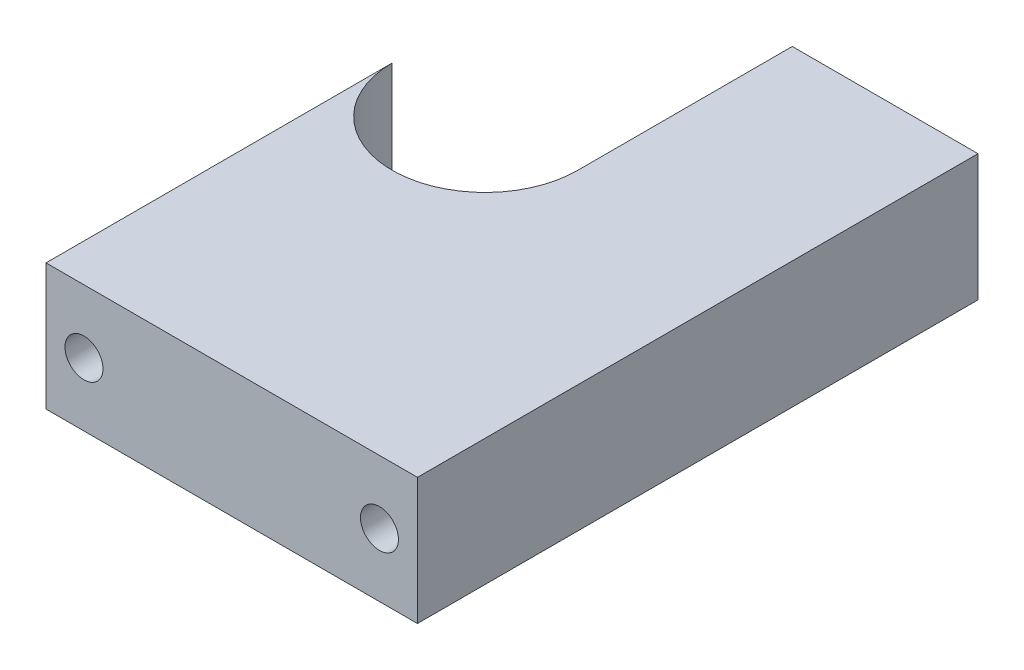
ISO-10303-21;
HEADER;
FILE_DESCRIPTION(('STEP AP214'),'2;1');
FILE_NAME('part.step','',(''),(''),'','','');
FILE_SCHEMA(('AUTOMOTIVE_DESIGN { 1 0 10303 214 1 1 1 1 }'));
ENDSEC;
DATA;
#1=APPLICATION_CONTEXT('core data for automotive mechanical design processes');
#2=APPLICATION_PROTOCOL_DEFINITION('international standard','automotive_design',2000,#1);
#3=PRODUCT_CONTEXT('',#1,'mechanical');
#4=PRODUCT('Part','Part','',(#3));
#5=PRODUCT_RELATED_PRODUCT_CATEGORY('part','',(#4));
#6=PRODUCT_DEFINITION_FORMATION('','',#4);
#7=PRODUCT_DEFINITION_CONTEXT('part definition',#1,'design');
#8=PRODUCT_DEFINITION('design','',#6,#7);
#9=PRODUCT_DEFINITION_SHAPE('','',#8);
#10=(LENGTH_UNIT() NAMED_UNIT(*) SI_UNIT(.MILLI.,.METRE.));
#11=(NAMED_UNIT(*) PLANE_ANGLE_UNIT() SI_UNIT($,.RADIAN.));
#12=(NAMED_UNIT(*) SI_UNIT($,.STERADIAN.) SOLID_ANGLE_UNIT());
#13=UNCERTAINTY_MEASURE_WITH_UNIT(LENGTH_MEASURE(1.E-05),#10,'distance_accuracy_value','');
#14=(GEOMETRIC_REPRESENTATION_CONTEXT(3) GLOBAL_UNCERTAINTY_ASSIGNED_CONTEXT((#13)) GLOBAL_UNIT_ASSIGNED_CONTEXT((#10,
#11,#12)) REPRESENTATION_CONTEXT('',''));
#15=CARTESIAN_POINT('',(0.,0.,0.));
#16=DIRECTION('',(0.,0.,1.));
#17=DIRECTION('',(1.,0.,0.));
#18=AXIS2_PLACEMENT_3D('',#15,#16,#17);
#19=CARTESIAN_POINT('',(44.,15.,0.));
#20=DIRECTION('',(0.,0.,-1.));
#21=DIRECTION('',(-1.,0.,0.));
#22=AXIS2_PLACEMENT_3D('',#19,#20,#21);
#23=PLANE('',#22);
#24=CARTESIAN_POINT('',(39.5,7.5,0.));
#25=DIRECTION('',(0.,0.,-1.));
#26=DIRECTION('',(-1.,0.,0.));
#27=AXIS2_PLACEMENT_3D('',#24,#25,#26);
#28=CIRCLE('',#27,2.25);
#29=CARTESIAN_POINT('',(37.25,7.5,0.));
#30=VERTEX_POINT('',#29);
#31=EDGE_CURVE('E192',#30,#30,#28,.T.);
#32=ORIENTED_EDGE('',*,*,#31,.T.);
#33=EDGE_LOOP('',(#32));
#34=FACE_BOUND('',#33,.T.);
#35=CARTESIAN_POINT('',(4.5,7.5,2.77555756156289E-13));
#36=DIRECTION('',(0.,0.,-1.));
#37=DIRECTION('',(-1.,0.,0.));
#38=AXIS2_PLACEMENT_3D('',#35,#36,#37);
#39=CIRCLE('',#38,2.24999999999999);
#40=CARTESIAN_POINT('',(2.25,7.5,2.77555756156289E-13));
#41=VERTEX_POINT('',#40);
#42=EDGE_CURVE('E143',#41,#41,#39,.T.);
#43=ORIENTED_EDGE('',*,*,#42,.T.);
#44=EDGE_LOOP('',(#43));
#45=FACE_BOUND('',#44,.T.);
#46=DIRECTION('',(1.,0.,0.));
#47=VECTOR('',#46,1.);
#48=CARTESIAN_POINT('',(44.,0.,0.));
#49=LINE('',#48,#47);
#50=CARTESIAN_POINT('',(0.,0.,0.));
#51=VERTEX_POINT('',#50);
#52=CARTESIAN_POINT('',(44.,0.,0.));
#53=VERTEX_POINT('',#52);
#54=EDGE_CURVE('E138',#51,#53,#49,.T.);
#55=ORIENTED_EDGE('',*,*,#54,.T.);
#56=DIRECTION('',(0.,-1.,0.));
#57=VECTOR('',#56,1.);
#58=CARTESIAN_POINT('',(44.,15.,0.));
#59=LINE('',#58,#57);
#60=CARTESIAN_POINT('',(44.,15.,0.));
#61=VERTEX_POINT('',#60);
#62=EDGE_CURVE('E11',#61,#53,#59,.T.);
#63=ORIENTED_EDGE('',*,*,#62,.F.);
#64=DIRECTION('',(1.,0.,0.));
#65=VECTOR('',#64,1.);
#66=CARTESIAN_POINT('',(44.,15.,0.));
#67=LINE('',#66,#65);
#68=CARTESIAN_POINT('',(0.,15.,0.));
#69=VERTEX_POINT('',#68);
#70=EDGE_CURVE('E155',#69,#61,#67,.T.);
#71=ORIENTED_EDGE('',*,*,#70,.F.);
#72=DIRECTION('',(0.,-1.,0.));
#73=VECTOR('',#72,1.);
#74=CARTESIAN_POINT('',(0.,15.,0.));
#75=LINE('',#74,#73);
#76=EDGE_CURVE('E134',#69,#51,#75,.T.);
#77=ORIENTED_EDGE('',*,*,#76,.T.);
#78=EDGE_LOOP('',(#55,#63,#71,#77));
#79=FACE_BOUND('',#78,.T.);
#80=ADVANCED_FACE('F43',(#34,#45,#79),#23,.F.);
#81=CARTESIAN_POINT('',(44.,15.,-66.4));
#82=DIRECTION('',(-1.,0.,0.));
#83=DIRECTION('',(0.,0.,1.));
#84=AXIS2_PLACEMENT_3D('',#81,#82,#83);
#85=PLANE('',#84);
#86=DIRECTION('',(0.,0.,-1.));
#87=VECTOR('',#86,1.);
#88=CARTESIAN_POINT('',(44.,0.,-66.4));
#89=LINE('',#88,#87);
#90=CARTESIAN_POINT('',(44.,0.,-66.4));
#91=VERTEX_POINT('',#90);
#92=EDGE_CURVE('E142',#53,#91,#89,.T.);
#93=ORIENTED_EDGE('',*,*,#92,.T.);
#94=DIRECTION('',(0.,-1.,0.));
#95=VECTOR('',#94,1.);
#96=CARTESIAN_POINT('',(44.,15.,-66.4));
#97=LINE('',#96,#95);
#98=CARTESIAN_POINT('',(44.,15.,-66.4));
#99=VERTEX_POINT('',#98);
#100=EDGE_CURVE('E58',#99,#91,#97,.T.);
#101=ORIENTED_EDGE('',*,*,#100,.F.);
#102=DIRECTION('',(0.,0.,-1.));
#103=VECTOR('',#102,1.);
#104=CARTESIAN_POINT('',(44.,15.,-41.));
#105=LINE('',#104,#103);
#106=EDGE_CURVE('E103',#61,#99,#105,.T.);
#107=ORIENTED_EDGE('',*,*,#106,.F.);
#108=ORIENTED_EDGE('',*,*,#62,.T.);
#109=EDGE_LOOP('',(#93,#101,#107,#108));
#110=FACE_BOUND('',#109,.T.);
#111=ADVANCED_FACE('F184',(#110),#85,.F.);
#112=CARTESIAN_POINT('',(22.,15.,-66.4));
#113=DIRECTION('',(0.,0.,1.));
#114=DIRECTION('',(1.,0.,0.));
#115=AXIS2_PLACEMENT_3D('',#112,#113,#114);
#116=PLANE('',#115);
#117=CARTESIAN_POINT('',(39.5,7.5,-66.4000000000006));
#118=DIRECTION('',(0.,0.,1.));
#119=DIRECTION('',(1.,0.,0.));
#120=AXIS2_PLACEMENT_3D('',#117,#118,#119);
#121=CIRCLE('',#120,3.74999999999999);
#122=CARTESIAN_POINT('',(43.25,7.5,-66.4000000000006));
#123=VERTEX_POINT('',#122);
#124=EDGE_CURVE('E218',#123,#123,#121,.T.);
#125=ORIENTED_EDGE('',*,*,#124,.T.);
#126=EDGE_LOOP('',(#125));
#127=FACE_BOUND('',#126,.T.);
#128=DIRECTION('',(-1.,0.,0.));
#129=VECTOR('',#128,1.);
#130=CARTESIAN_POINT('',(22.,0.,-66.4));
#131=LINE('',#130,#129);
#132=CARTESIAN_POINT('',(22.,0.,-66.4));
#133=VERTEX_POINT('',#132);
#134=EDGE_CURVE('E146',#91,#133,#131,.T.);
#135=ORIENTED_EDGE('',*,*,#134,.T.);
#136=DIRECTION('',(0.,-1.,0.));
#137=VECTOR('',#136,1.);
#138=CARTESIAN_POINT('',(22.,15.,-66.4));
#139=LINE('',#138,#137);
#140=CARTESIAN_POINT('',(22.,15.,-66.4));
#141=VERTEX_POINT('',#140);
#142=EDGE_CURVE('E127',#141,#133,#139,.T.);
#143=ORIENTED_EDGE('',*,*,#142,.F.);
#144=DIRECTION('',(-1.,0.,0.));
#145=VECTOR('',#144,1.);
#146=CARTESIAN_POINT('',(22.,15.,-66.4));
#147=LINE('',#146,#145);
#148=EDGE_CURVE('E116',#99,#141,#147,.T.);
#149=ORIENTED_EDGE('',*,*,#148,.F.);
#150=ORIENTED_EDGE('',*,*,#100,.T.);
#151=EDGE_LOOP('',(#135,#143,#149,#150));
#152=FACE_BOUND('',#151,.T.);
#153=ADVANCED_FACE('F166',(#127,#152),#116,.F.);
#154=CARTESIAN_POINT('',(22.,15.,-41.));
#155=DIRECTION('',(1.,0.,0.));
#156=DIRECTION('',(0.,0.,-1.));
#157=AXIS2_PLACEMENT_3D('',#154,#155,#156);
#158=PLANE('',#157);
#159=DIRECTION('',(0.,0.,1.));
#160=VECTOR('',#159,1.);
#161=CARTESIAN_POINT('',(22.,0.,-41.));
#162=LINE('',#161,#160);
#163=CARTESIAN_POINT('',(22.,0.,-41.));
#164=VERTEX_POINT('',#163);
#165=EDGE_CURVE('E125',#133,#164,#162,.T.);
#166=ORIENTED_EDGE('',*,*,#165,.T.);
#167=DIRECTION('',(0.,-1.,0.));
#168=VECTOR('',#167,1.);
#169=CARTESIAN_POINT('',(22.,15.,-41.));
#170=LINE('',#169,#168);
#171=CARTESIAN_POINT('',(22.,15.,-41.));
#172=VERTEX_POINT('',#171);
#173=EDGE_CURVE('E122',#172,#164,#170,.T.);
#174=ORIENTED_EDGE('',*,*,#173,.F.);
#175=DIRECTION('',(0.,0.,1.));
#176=VECTOR('',#175,1.);
#177=CARTESIAN_POINT('',(22.,15.,-41.));
#178=LINE('',#177,#176);
#179=EDGE_CURVE('E110',#141,#172,#178,.T.);
#180=ORIENTED_EDGE('',*,*,#179,.F.);
#181=ORIENTED_EDGE('',*,*,#142,.T.);
#182=EDGE_LOOP('',(#166,#174,#180,#181));
#183=FACE_BOUND('',#182,.T.);
#184=ADVANCED_FACE('F123',(#183),#158,.F.);
#185=CARTESIAN_POINT('',(11.,15.,-41.));
#186=DIRECTION('',(0.,-1.,0.));
#187=DIRECTION('',(0.,0.,-1.));
#188=AXIS2_PLACEMENT_3D('',#185,#186,#187);
#189=CYLINDRICAL_SURFACE('',#188,11.);
#190=CARTESIAN_POINT('',(8.24999999999999,7.5,-30.3492957979296));
#191=CARTESIAN_POINT('',(8.24998926832039,7.70361406298795,-30.3492937831677));
#192=CARTESIAN_POINT('',(8.23335640634176,7.90734294759356,-30.3535503378569));
#193=CARTESIAN_POINT('',(8.16732904453376,8.30914994249432,-30.3709314191177));
#194=CARTESIAN_POINT('',(8.11790715676136,8.50722318437302,-30.3840633592727));
#195=CARTESIAN_POINT('',(7.98800466330271,8.89194692486515,-30.4201888470224));
#196=CARTESIAN_POINT('',(7.90752859572308,9.07859908788414,-30.443180953755));
#197=CARTESIAN_POINT('',(7.71846273905328,9.43512242005201,-30.5004182710902));
#198=CARTESIAN_POINT('',(7.60988076670333,9.60499823687504,-30.5346603535909));
#199=CARTESIAN_POINT('',(7.36907202447624,9.92292886251445,-30.6157617967962));
#200=CARTESIAN_POINT('',(7.23690764578341,10.0710394138529,-30.6625880255991));
#201=CARTESIAN_POINT('',(6.95397577071791,10.3423448655019,-30.7700179200347));
#202=CARTESIAN_POINT('',(6.80320867552987,10.4655403029785,-30.8306212885744));
#203=CARTESIAN_POINT('',(6.48690419814857,10.6862836662458,-30.9669563308489));
#204=CARTESIAN_POINT('',(6.32119848957127,10.7834725743625,-31.0428766727447));
#205=CARTESIAN_POINT('',(5.98293052736344,10.9494860235795,-31.2089566804726));
#206=CARTESIAN_POINT('',(5.81036671359034,11.0183040696585,-31.2991196003707));
#207=CARTESIAN_POINT('',(5.45149226999421,11.1325117591741,-31.4995125207189));
#208=CARTESIAN_POINT('',(5.26508516800008,11.1758616310312,-31.6107191320377));
#209=CARTESIAN_POINT('',(4.89614199199506,11.2336964897356,-31.8462644550042));
#210=CARTESIAN_POINT('',(4.71360812125054,11.2481654614567,-31.9706104125076));
#211=CARTESIAN_POINT('',(4.40542434369582,11.2510490781131,-32.1944723019615));
#212=CARTESIAN_POINT('',(4.27790730473419,11.2455226941169,-32.2914410513016));
#213=CARTESIAN_POINT('',(4.02786388177402,11.2222779429282,-32.490309990333));
#214=CARTESIAN_POINT('',(3.90533929588231,11.2045552234437,-32.5922119283728));
#215=CARTESIAN_POINT('',(3.66581047810065,11.1580792983658,-32.8003114033518));
#216=CARTESIAN_POINT('',(3.54881677274687,11.1293059406783,-32.9065164691547));
#217=CARTESIAN_POINT('',(3.32099294071984,11.0618197949264,-33.1223426229841));
#218=CARTESIAN_POINT('',(3.21016435425049,11.0231045365686,-33.2319645540526));
#219=CARTESIAN_POINT('',(2.96142076819571,10.9232166400158,-33.4885200029182));
#220=CARTESIAN_POINT('',(2.82581907617089,10.8588050291984,-33.6364415962019));
#221=CARTESIAN_POINT('',(2.56593465639611,10.7161899430797,-33.9355940310629));
#222=CARTESIAN_POINT('',(2.44165676905583,10.6379806114347,-34.0868262538438));
#223=CARTESIAN_POINT('',(2.20447291032839,10.4688854620161,-34.3912217826246));
#224=CARTESIAN_POINT('',(2.0915725306759,10.3779934628811,-34.5443859969399));
#225=CARTESIAN_POINT('',(1.87724473054898,10.1841284582593,-34.850993854234));
#226=CARTESIAN_POINT('',(1.77581237575186,10.0811606877404,-35.0044373479489));
#227=CARTESIAN_POINT('',(1.62056564123583,9.90406123913325,-35.2520604574776));
#228=CARTESIAN_POINT('',(1.56322448129476,9.83370779381781,-35.3467567446533));
#229=CARTESIAN_POINT('',(1.45306146761581,9.68792533580831,-35.5348530465461));
#230=CARTESIAN_POINT('',(1.40023884525369,9.61249719025975,-35.6282532794544));
#231=CARTESIAN_POINT('',(1.29933467025176,9.45624046834239,-35.8126966884385));
#232=CARTESIAN_POINT('',(1.25124330578589,9.37542367756651,-35.9037444408998));
#233=CARTESIAN_POINT('',(1.15992913438875,9.20750129856008,-36.0823734524877));
#234=CARTESIAN_POINT('',(1.11670389075701,9.12039889402032,-36.1699564322131));
#235=CARTESIAN_POINT('',(1.03486833455522,8.93722112093185,-36.3411070158363));
#236=CARTESIAN_POINT('',(0.996345028943356,8.84102233113487,-36.424585558));
#237=CARTESIAN_POINT('',(0.925599863251057,8.6391260291607,-36.5825448718347));
#238=CARTESIAN_POINT('',(0.893376589668206,8.53343065546352,-36.657027660395));
#239=CARTESIAN_POINT('',(0.843675697788952,8.33749424631999,-36.7748197416688));
#240=CARTESIAN_POINT('',(0.824515332927211,8.24963950225374,-36.8213195175742));
#241=CARTESIAN_POINT('',(0.791996787050548,8.06721546233087,-36.9013970018399));
#242=CARTESIAN_POINT('',(0.778623837678431,7.97266398215949,-36.9350075756455));
#243=CARTESIAN_POINT('',(0.761161743873593,7.79911550714807,-36.9792239272218));
#244=CARTESIAN_POINT('',(0.755695409001041,7.72114023637045,-36.9932204825216));
#245=CARTESIAN_POINT('',(0.749718350192077,7.56377573271794,-37.008533784663));
#246=CARTESIAN_POINT('',(0.749203294048665,7.48438779683262,-37.0098616162161));
#247=CARTESIAN_POINT('',(0.753176564713224,7.32668838969287,-36.9996710281453));
#248=CARTESIAN_POINT('',(0.757659552350274,7.24837586002487,-36.9881663169065));
#249=CARTESIAN_POINT('',(0.771167940802111,7.09467556724247,-36.9538503016667));
#250=CARTESIAN_POINT('',(0.780199210638742,7.01929171897046,-36.9310243895694));
#251=CARTESIAN_POINT('',(0.80824797506672,6.83153000578096,-36.8611284501885));
#252=CARTESIAN_POINT('',(0.830025742485597,6.72199528426661,-36.8076377406723));
#253=CARTESIAN_POINT('',(0.880697675284587,6.51265844756666,-36.6867608181811));
#254=CARTESIAN_POINT('',(0.909616579903018,6.41289188702327,-36.619326434723));
#255=CARTESIAN_POINT('',(0.973451915486177,6.22082693946124,-36.4751096955881));
#256=CARTESIAN_POINT('',(1.00842855064372,6.12861871089259,-36.3982360051975));
#257=CARTESIAN_POINT('',(1.08337917305104,5.95129918778056,-36.2388648536631));
#258=CARTESIAN_POINT('',(1.12335823199693,5.86619524399636,-36.1563617242816));
#259=CARTESIAN_POINT('',(1.20793318792393,5.70184818734771,-35.9875790803109));
#260=CARTESIAN_POINT('',(1.25253949653859,5.62261901079359,-35.9012913131092));
#261=CARTESIAN_POINT('',(1.34605267128432,5.46944319867306,-35.7263717200841));
#262=CARTESIAN_POINT('',(1.3949608329189,5.39549816666214,-35.6377391937939));
#263=CARTESIAN_POINT('',(1.53530541872769,5.19851242974008,-35.3917915243034));
#264=CARTESIAN_POINT('',(1.63105494113782,5.08038879539056,-35.2329707461976));
#265=CARTESIAN_POINT('',(1.83506813584977,4.85737788750026,-34.9139534374758));
#266=CARTESIAN_POINT('',(1.94334013784012,4.75249952257531,-34.7537560575093));
#267=CARTESIAN_POINT('',(2.17222301797357,4.55607914838857,-34.4342605363935));
#268=CARTESIAN_POINT('',(2.29282238374321,4.46452488615989,-34.2749617002156));
#269=CARTESIAN_POINT('',(2.54639202605807,4.29545401699986,-33.9588682461031));
#270=CARTESIAN_POINT('',(2.67935603581036,4.2179303569849,-33.8020724062782));
#271=CARTESIAN_POINT('',(2.92391051229738,4.09524511459597,-33.5299470943302));
#272=CARTESIAN_POINT('',(3.03289869977983,4.04679054226755,-33.4137555639746));
#273=CARTESIAN_POINT('',(3.25775688139561,3.95968010390686,-33.1844101966366));
#274=CARTESIAN_POINT('',(3.37362528353445,3.92102198192126,-33.0712556656619));
#275=CARTESIAN_POINT('',(3.61177133250961,3.85461830668094,-32.8488909370838));
#276=CARTESIAN_POINT('',(3.73403922882124,3.82685666983966,-32.7396751438174));
#277=CARTESIAN_POINT('',(3.98460300006457,3.78341246442106,-32.5258448754735));
#278=CARTESIAN_POINT('',(4.11289737910032,3.76772691494735,-32.4212292708878));
#279=CARTESIAN_POINT('',(4.34585046923001,3.75177308593606,-32.2399179580901));
#280=CARTESIAN_POINT('',(4.44949475294532,3.7488709361562,-32.162145932495));
#281=CARTESIAN_POINT('',(4.65937688945429,3.75191930760173,-32.0103806157552));
#282=CARTESIAN_POINT('',(4.76561413787301,3.75786778491999,-31.9363864562556));
#283=CARTESIAN_POINT('',(4.98000865342701,3.77928780740705,-31.792591699652));
#284=CARTESIAN_POINT('',(5.08816640656618,3.79476179744731,-31.7227921842188));
#285=CARTESIAN_POINT('',(5.30541556717209,3.83584682408357,-31.5878776884797));
#286=CARTESIAN_POINT('',(5.41450646553561,3.86145264002766,-31.5227603159821));
#287=CARTESIAN_POINT('',(5.6336091612153,3.92361676646668,-31.3969820855069));
#288=CARTESIAN_POINT('',(5.74361995970709,3.96027591596059,-31.336368952888));
#289=CARTESIAN_POINT('',(5.96222178569676,4.04483877768193,-31.2206295856759));
#290=CARTESIAN_POINT('',(6.07081277804958,4.09274276770332,-31.1655034866828));
#291=CARTESIAN_POINT('',(6.28502162834323,4.19991979885127,-31.0610276722814));
#292=CARTESIAN_POINT('',(6.39064162743713,4.25918439862196,-31.0116737115276));
#293=CARTESIAN_POINT('',(6.59741443691852,4.38901201255939,-30.918825385265));
#294=CARTESIAN_POINT('',(6.69856807292367,4.45957292732625,-30.875329933723));
#295=CARTESIAN_POINT('',(6.8803375870154,4.60039712980113,-30.8001673309168));
#296=CARTESIAN_POINT('',(6.9617823338048,4.66916977931013,-30.7677017738549));
#297=CARTESIAN_POINT('',(7.11931466870969,4.81426849693885,-30.7069242875179));
#298=CARTESIAN_POINT('',(7.19540277756275,4.89059382909562,-30.6786119542026));
#299=CARTESIAN_POINT('',(7.34131220939567,5.05027708053338,-30.6259929828013));
#300=CARTESIAN_POINT('',(7.41113407112611,5.13363439403081,-30.6016860001984));
#301=CARTESIAN_POINT('',(7.54369323486773,5.30675687758567,-30.5568759085103));
#302=CARTESIAN_POINT('',(7.60643086401573,5.39652175144106,-30.5363726237491));
#303=CARTESIAN_POINT('',(7.71952791291976,5.57454320915715,-30.5003929791758));
#304=CARTESIAN_POINT('',(7.7704700126532,5.66237666091457,-30.4846500503936));
#305=CARTESIAN_POINT('',(7.86524022932982,5.84229079611095,-30.4560096019516));
#306=CARTESIAN_POINT('',(7.90906558395767,5.93437311099369,-30.4431131864519));
#307=CARTESIAN_POINT('',(7.9891148568966,6.12197157156867,-30.4200044023935));
#308=CARTESIAN_POINT('',(8.02534839323662,6.21748319068866,-30.4097886335456));
#309=CARTESIAN_POINT('',(8.08996031615715,6.41136055687297,-30.3918527409681));
#310=CARTESIAN_POINT('',(8.11833721744765,6.50972683973094,-30.3841330890811));
#311=CARTESIAN_POINT('',(8.17820705181091,6.75457237005456,-30.3680258496395));
#312=CARTESIAN_POINT('',(8.20509019593947,6.90229796553618,-30.3609752950746));
#313=CARTESIAN_POINT('',(8.24099078015165,7.19999490026998,-30.3516109700768));
#314=CARTESIAN_POINT('',(8.25000790767494,7.34996627876519,-30.3492972825138));
#315=CARTESIAN_POINT('',(8.24999999999999,7.5,-30.3492957979296));
#316=B_SPLINE_CURVE_WITH_KNOTS('',3,(#190,#191,#192,#193,#194,#195,#196,#197,#198,#199,#200,
#201,#202,#203,#204,#205,#206,#207,#208,#209,#210,#211,#212,#213,#214,#215,#216,#217,#218,#219,
#220,#221,#222,#223,#224,#225,#226,#227,#228,#229,#230,#231,#232,#233,#234,#235,#236,#237,#238,
#239,#240,#241,#242,#243,#244,#245,#246,#247,#248,#249,#250,#251,#252,#253,#254,#255,#256,#257,
#258,#259,#260,#261,#262,#263,#264,#265,#266,#267,#268,#269,#270,#271,#272,#273,#274,#275,#276,
#277,#278,#279,#280,#281,#282,#283,#284,#285,#286,#287,#288,#289,#290,#291,#292,#293,#294,#295,
#296,#297,#298,#299,#300,#301,#302,#303,#304,#305,#306,#307,#308,#309,#310,#311,#312,#313,#314,
#315),.UNSPECIFIED.,.T.,.F.,(4,2,2,2,2,2,2,2,2,2,2,2,2,2,2,2,2,2,2,2,2,2,2,2,2,2,2,2,2,2,2,2,2,
2,2,2,2,2,2,2,2,2,2,2,2,2,2,2,2,2,2,2,2,2,2,2,2,2,2,2,2,2,4),(0.,0.610322492367673,
1.22115541642171,1.83189911011065,2.44247312753617,3.05145509540822,3.66042393232074,
4.27741018735565,4.89453761245579,5.55602736884081,6.21788383478636,6.69815939629564,
7.17860643423881,7.65993381435613,8.14138090721784,8.77276179431749,9.40441131408747,
10.0363697736912,10.6680552786715,11.0614047616999,11.4546872005434,11.8471360404463,
12.2393874799206,12.6380520843641,13.0366271397886,13.3394619966312,13.6415194547196,
13.8786911991802,14.1156554072112,14.3523667200643,14.5893842665995,14.9587279109194,
15.3293694888493,15.7039315904427,16.0788765655861,16.4546842859371,16.8306055708702,
17.48934552004,18.1485261968707,18.8070968018187,19.4653354228803,19.9644677239612,
20.4634849788282,20.9617628719542,21.4599177292512,21.8484052896197,22.2368031490829,
22.6253007385052,23.0135984059188,23.4055515628178,23.7975144035963,24.1891871224623,
24.5807871339784,24.9146376482098,25.2484556627164,25.5822449491372,25.9160188154743,
26.2239016952795,26.5319037935228,26.8395132943163,27.1471809087713,27.5968912647836,
28.0466094882672),.UNSPECIFIED.);
#317=CARTESIAN_POINT('',(8.24999999999999,7.5,-30.3492957979296));
#318=VERTEX_POINT('',#317);
#319=EDGE_CURVE('E46',#318,#318,#316,.T.);
#320=ORIENTED_EDGE('',*,*,#319,.T.);
#321=EDGE_LOOP('',(#320));
#322=FACE_BOUND('',#321,.T.);
#323=CARTESIAN_POINT('',(11.,0.,-41.));
#324=DIRECTION('',(0.,-1.,0.));
#325=DIRECTION('',(0.,0.,-1.));
#326=AXIS2_PLACEMENT_3D('',#323,#324,#325);
#327=CIRCLE('',#326,11.);
#328=CARTESIAN_POINT('',(0.,0.,-41.));
#329=VERTEX_POINT('',#328);
#330=EDGE_CURVE('E89',#164,#329,#327,.T.);
#331=ORIENTED_EDGE('',*,*,#330,.T.);
#332=DIRECTION('',(0.,-1.,0.));
#333=VECTOR('',#332,1.);
#334=CARTESIAN_POINT('',(0.,15.,-41.));
#335=LINE('',#334,#333);
#336=CARTESIAN_POINT('',(0.,15.,-41.));
#337=VERTEX_POINT('',#336);
#338=EDGE_CURVE('E128',#337,#329,#335,.T.);
#339=ORIENTED_EDGE('',*,*,#338,.F.);
#340=CARTESIAN_POINT('',(11.,15.,-41.));
#341=DIRECTION('',(0.,-1.,0.));
#342=DIRECTION('',(0.,0.,-1.));
#343=AXIS2_PLACEMENT_3D('',#340,#341,#342);
#344=CIRCLE('',#343,11.);
#345=EDGE_CURVE('E114',#172,#337,#344,.T.);
#346=ORIENTED_EDGE('',*,*,#345,.F.);
#347=ORIENTED_EDGE('',*,*,#173,.T.);
#348=EDGE_LOOP('',(#331,#339,#346,#347));
#349=FACE_BOUND('',#348,.T.);
#350=ADVANCED_FACE('F130',(#322,#349),#189,.F.);
#351=CARTESIAN_POINT('',(0.,15.,0.));
#352=DIRECTION('',(1.,0.,0.));
#353=DIRECTION('',(0.,0.,-1.));
#354=AXIS2_PLACEMENT_3D('',#351,#352,#353);
#355=PLANE('',#354);
#356=DIRECTION('',(0.,0.,1.));
#357=VECTOR('',#356,1.);
#358=CARTESIAN_POINT('',(0.,0.,0.));
#359=LINE('',#358,#357);
#360=EDGE_CURVE('E95',#329,#51,#359,.T.);
#361=ORIENTED_EDGE('',*,*,#360,.T.);
#362=ORIENTED_EDGE('',*,*,#76,.F.);
#363=DIRECTION('',(0.,0.,1.));
#364=VECTOR('',#363,1.);
#365=CARTESIAN_POINT('',(0.,15.,0.));
#366=LINE('',#365,#364);
#367=EDGE_CURVE('E66',#337,#69,#366,.T.);
#368=ORIENTED_EDGE('',*,*,#367,.F.);
#369=ORIENTED_EDGE('',*,*,#338,.T.);
#370=EDGE_LOOP('',(#361,#362,#368,#369));
#371=FACE_BOUND('',#370,.T.);
#372=ADVANCED_FACE('F173',(#371),#355,.F.);
#373=CARTESIAN_POINT('',(11.,15.,-41.));
#374=DIRECTION('',(0.,-1.,0.));
#375=DIRECTION('',(0.,0.,-1.));
#376=AXIS2_PLACEMENT_3D('',#373,#374,#375);
#377=PLANE('',#376);
#378=ORIENTED_EDGE('',*,*,#70,.T.);
#379=ORIENTED_EDGE('',*,*,#106,.T.);
#380=ORIENTED_EDGE('',*,*,#148,.T.);
#381=ORIENTED_EDGE('',*,*,#179,.T.);
#382=ORIENTED_EDGE('',*,*,#345,.T.);
#383=ORIENTED_EDGE('',*,*,#367,.T.);
#384=EDGE_LOOP('',(#378,#379,#380,#381,#382,#383));
#385=FACE_BOUND('',#384,.T.);
#386=ADVANCED_FACE('F112',(#385),#377,.F.);
#387=CARTESIAN_POINT('',(11.,0.,-41.));
#388=DIRECTION('',(0.,-1.,0.));
#389=DIRECTION('',(0.,0.,-1.));
#390=AXIS2_PLACEMENT_3D('',#387,#388,#389);
#391=PLANE('',#390);
#392=ORIENTED_EDGE('',*,*,#54,.F.);
#393=ORIENTED_EDGE('',*,*,#360,.F.);
#394=ORIENTED_EDGE('',*,*,#330,.F.);
#395=ORIENTED_EDGE('',*,*,#165,.F.);
#396=ORIENTED_EDGE('',*,*,#134,.F.);
#397=ORIENTED_EDGE('',*,*,#92,.F.);
#398=EDGE_LOOP('',(#392,#393,#394,#395,#396,#397));
#399=FACE_BOUND('',#398,.T.);
#400=ADVANCED_FACE('F169',(#399),#391,.T.);
#401=CARTESIAN_POINT('',(4.5,7.5,-12.7));
#402=DIRECTION('',(0.,0.,-1.));
#403=DIRECTION('',(-1.,0.,0.));
#404=AXIS2_PLACEMENT_3D('',#401,#402,#403);
#405=CYLINDRICAL_SURFACE('',#404,2.25);
#406=ORIENTED_EDGE('',*,*,#42,.F.);
#407=EDGE_LOOP('',(#406));
#408=FACE_BOUND('',#407,.T.);
#409=CARTESIAN_POINT('',(4.5,7.5,-12.7));
#410=DIRECTION('',(0.,0.,1.));
#411=DIRECTION('',(1.,0.,0.));
#412=AXIS2_PLACEMENT_3D('',#409,#410,#411);
#413=CIRCLE('',#412,2.25);
#414=CARTESIAN_POINT('',(6.74999999999999,7.5,-12.7));
#415=VERTEX_POINT('',#414);
#416=EDGE_CURVE('E199',#415,#415,#413,.F.);
#417=ORIENTED_EDGE('',*,*,#416,.T.);
#418=EDGE_LOOP('',(#417));
#419=FACE_BOUND('',#418,.T.);
#420=ADVANCED_FACE('F239',(#408,#419),#405,.F.);
#421=CARTESIAN_POINT('',(39.5,7.5,-12.7000000000003));
#422=DIRECTION('',(0.,0.,-1.));
#423=DIRECTION('',(-1.,0.,0.));
#424=AXIS2_PLACEMENT_3D('',#421,#422,#423);
#425=CYLINDRICAL_SURFACE('',#424,2.25);
#426=ORIENTED_EDGE('',*,*,#31,.F.);
#427=EDGE_LOOP('',(#426));
#428=FACE_BOUND('',#427,.T.);
#429=CARTESIAN_POINT('',(39.5,7.5,-12.7000000000003));
#430=DIRECTION('',(0.,0.,1.));
#431=DIRECTION('',(1.,0.,0.));
#432=AXIS2_PLACEMENT_3D('',#429,#430,#431);
#433=CIRCLE('',#432,2.25);
#434=CARTESIAN_POINT('',(41.75,7.5,-12.7000000000003));
#435=VERTEX_POINT('',#434);
#436=EDGE_CURVE('E214',#435,#435,#433,.F.);
#437=ORIENTED_EDGE('',*,*,#436,.T.);
#438=EDGE_LOOP('',(#437));
#439=FACE_BOUND('',#438,.T.);
#440=ADVANCED_FACE('F236',(#428,#439),#425,.F.);
#441=CARTESIAN_POINT('',(8.24999999999999,7.5,-12.7));
#442=DIRECTION('',(0.,0.,1.));
#443=DIRECTION('',(1.,0.,0.));
#444=AXIS2_PLACEMENT_3D('',#441,#442,#443);
#445=PLANE('',#444);
#446=CARTESIAN_POINT('',(4.5,7.5,-12.7));
#447=DIRECTION('',(0.,0.,1.));
#448=DIRECTION('',(1.,0.,0.));
#449=AXIS2_PLACEMENT_3D('',#446,#447,#448);
#450=CIRCLE('',#449,3.75);
#451=CARTESIAN_POINT('',(8.24999999999999,7.5,-12.7));
#452=VERTEX_POINT('',#451);
#453=EDGE_CURVE('E210',#452,#452,#450,.T.);
#454=ORIENTED_EDGE('',*,*,#453,.F.);
#455=EDGE_LOOP('',(#454));
#456=FACE_BOUND('',#455,.T.);
#457=ORIENTED_EDGE('',*,*,#416,.F.);
#458=EDGE_LOOP('',(#457));
#459=FACE_BOUND('',#458,.T.);
#460=ADVANCED_FACE('F238',(#456,#459),#445,.F.);
#461=CARTESIAN_POINT('',(4.5,7.5,-12.7));
#462=DIRECTION('',(0.,0.,1.));
#463=DIRECTION('',(1.,0.,0.));
#464=AXIS2_PLACEMENT_3D('',#461,#462,#463);
#465=CYLINDRICAL_SURFACE('',#464,3.74999999999999);
#466=ORIENTED_EDGE('',*,*,#453,.T.);
#467=EDGE_LOOP('',(#466));
#468=FACE_BOUND('',#467,.T.);
#469=ORIENTED_EDGE('',*,*,#319,.F.);
#470=EDGE_LOOP('',(#469));
#471=FACE_BOUND('',#470,.T.);
#472=ADVANCED_FACE('F232',(#468,#471),#465,.F.);
#473=CARTESIAN_POINT('',(43.25,7.5,-12.7000000000003));
#474=DIRECTION('',(0.,0.,1.));
#475=DIRECTION('',(1.,0.,0.));
#476=AXIS2_PLACEMENT_3D('',#473,#474,#475);
#477=PLANE('',#476);
#478=CARTESIAN_POINT('',(39.5,7.5,-12.7000000000003));
#479=DIRECTION('',(0.,0.,1.));
#480=DIRECTION('',(1.,0.,0.));
#481=AXIS2_PLACEMENT_3D('',#478,#479,#480);
#482=CIRCLE('',#481,3.75);
#483=CARTESIAN_POINT('',(43.25,7.5,-12.7000000000003));
#484=VERTEX_POINT('',#483);
#485=EDGE_CURVE('E222',#484,#484,#482,.T.);
#486=ORIENTED_EDGE('',*,*,#485,.F.);
#487=EDGE_LOOP('',(#486));
#488=FACE_BOUND('',#487,.T.);
#489=ORIENTED_EDGE('',*,*,#436,.F.);
#490=EDGE_LOOP('',(#489));
#491=FACE_BOUND('',#490,.T.);
#492=ADVANCED_FACE('F229',(#488,#491),#477,.F.);
#493=CARTESIAN_POINT('',(39.5,7.5,-12.7000000000003));
#494=DIRECTION('',(0.,0.,1.));
#495=DIRECTION('',(1.,0.,0.));
#496=AXIS2_PLACEMENT_3D('',#493,#494,#495);
#497=CYLINDRICAL_SURFACE('',#496,3.74999999999999);
#498=ORIENTED_EDGE('',*,*,#124,.F.);
#499=EDGE_LOOP('',(#498));
#500=FACE_BOUND('',#499,.T.);
#501=ORIENTED_EDGE('',*,*,#485,.T.);
#502=EDGE_LOOP('',(#501));
#503=FACE_BOUND('',#502,.T.);
#504=ADVANCED_FACE('F227',(#500,#503),#497,.F.);
#505=CLOSED_SHELL('',(#80,#111,#153,#184,#350,#372,#386,#400,#420,#440,#460,#472,#492,#504));
#506=MANIFOLD_SOLID_BREP('B2',#505);
#507=ADVANCED_BREP_SHAPE_REPRESENTATION('',(#18,#506),#14);
#508=SHAPE_DEFINITION_REPRESENTATION(#9,#507);
ENDSEC;
END-ISO-10303-21;
